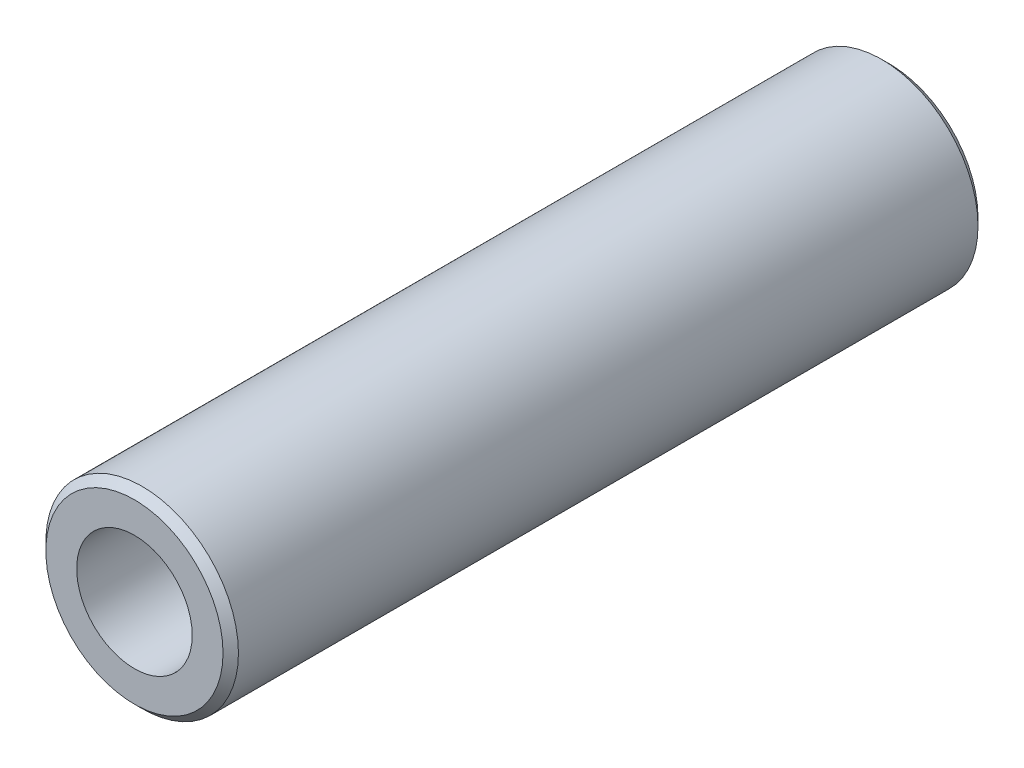
ISO-10303-21;
HEADER;
FILE_DESCRIPTION(('STEP AP214'),'2;1');
FILE_NAME('part.step','',(''),(''),'','','');
FILE_SCHEMA(('AUTOMOTIVE_DESIGN { 1 0 10303 214 1 1 1 1 }'));
ENDSEC;
DATA;
#1=APPLICATION_CONTEXT('core data for automotive mechanical design processes');
#2=APPLICATION_PROTOCOL_DEFINITION('international standard','automotive_design',2000,#1);
#3=PRODUCT_CONTEXT('',#1,'mechanical');
#4=PRODUCT('Part','Part','',(#3));
#5=PRODUCT_RELATED_PRODUCT_CATEGORY('part','',(#4));
#6=PRODUCT_DEFINITION_FORMATION('','',#4);
#7=PRODUCT_DEFINITION_CONTEXT('part definition',#1,'design');
#8=PRODUCT_DEFINITION('design','',#6,#7);
#9=PRODUCT_DEFINITION_SHAPE('','',#8);
#10=(LENGTH_UNIT() NAMED_UNIT(*) SI_UNIT(.MILLI.,.METRE.));
#11=(NAMED_UNIT(*) PLANE_ANGLE_UNIT() SI_UNIT($,.RADIAN.));
#12=(NAMED_UNIT(*) SI_UNIT($,.STERADIAN.) SOLID_ANGLE_UNIT());
#13=UNCERTAINTY_MEASURE_WITH_UNIT(LENGTH_MEASURE(1.E-05),#10,'distance_accuracy_value','');
#14=(GEOMETRIC_REPRESENTATION_CONTEXT(3) GLOBAL_UNCERTAINTY_ASSIGNED_CONTEXT((#13)) GLOBAL_UNIT_ASSIGNED_CONTEXT((#10,
#11,#12)) REPRESENTATION_CONTEXT('',''));
#15=CARTESIAN_POINT('',(0.,0.,0.));
#16=DIRECTION('',(0.,0.,1.));
#17=DIRECTION('',(1.,0.,0.));
#18=AXIS2_PLACEMENT_3D('',#15,#16,#17);
#19=CARTESIAN_POINT('',(0.,0.,24.5));
#20=DIRECTION('',(0.,0.,1.));
#21=DIRECTION('',(1.,0.,0.));
#22=AXIS2_PLACEMENT_3D('',#19,#20,#21);
#23=PLANE('',#22);
#24=CARTESIAN_POINT('',(0.,0.,24.5));
#25=DIRECTION('',(0.,0.,1.));
#26=DIRECTION('',(1.,0.,0.));
#27=AXIS2_PLACEMENT_3D('',#24,#25,#26);
#28=CIRCLE('',#27,5.75);
#29=CARTESIAN_POINT('',(5.75,0.,24.5));
#30=VERTEX_POINT('',#29);
#31=EDGE_CURVE('E11',#30,#30,#28,.T.);
#32=ORIENTED_EDGE('',*,*,#31,.T.);
#33=EDGE_LOOP('',(#32));
#34=FACE_BOUND('',#33,.T.);
#35=CARTESIAN_POINT('',(0.,0.,24.5));
#36=DIRECTION('',(0.,0.,1.));
#37=DIRECTION('',(1.,0.,0.));
#38=AXIS2_PLACEMENT_3D('',#35,#36,#37);
#39=CIRCLE('',#38,3.75);
#40=CARTESIAN_POINT('',(3.75,0.,24.5));
#41=VERTEX_POINT('',#40);
#42=EDGE_CURVE('E70',#41,#41,#39,.T.);
#43=ORIENTED_EDGE('',*,*,#42,.F.);
#44=EDGE_LOOP('',(#43));
#45=FACE_BOUND('',#44,.T.);
#46=ADVANCED_FACE('F49',(#34,#45),#23,.T.);
#47=CARTESIAN_POINT('',(0.,0.,-24.5));
#48=DIRECTION('',(0.,0.,1.));
#49=DIRECTION('',(1.,0.,0.));
#50=AXIS2_PLACEMENT_3D('',#47,#48,#49);
#51=PLANE('',#50);
#52=CARTESIAN_POINT('',(0.,0.,-24.5));
#53=DIRECTION('',(0.,0.,1.));
#54=DIRECTION('',(1.,0.,0.));
#55=AXIS2_PLACEMENT_3D('',#52,#53,#54);
#56=CIRCLE('',#55,5.74999999999998);
#57=CARTESIAN_POINT('',(5.74999999999998,0.,-24.5));
#58=VERTEX_POINT('',#57);
#59=EDGE_CURVE('E57',#58,#58,#56,.F.);
#60=ORIENTED_EDGE('',*,*,#59,.T.);
#61=EDGE_LOOP('',(#60));
#62=FACE_BOUND('',#61,.T.);
#63=CARTESIAN_POINT('',(0.,0.,-24.5));
#64=DIRECTION('',(0.,0.,1.));
#65=DIRECTION('',(1.,0.,0.));
#66=AXIS2_PLACEMENT_3D('',#63,#64,#65);
#67=CIRCLE('',#66,3.75);
#68=CARTESIAN_POINT('',(3.75,0.,-24.5));
#69=VERTEX_POINT('',#68);
#70=EDGE_CURVE('E71',#69,#69,#67,.T.);
#71=ORIENTED_EDGE('',*,*,#70,.T.);
#72=EDGE_LOOP('',(#71));
#73=FACE_BOUND('',#72,.T.);
#74=ADVANCED_FACE('F81',(#62,#73),#51,.F.);
#75=CARTESIAN_POINT('',(0.,0.,24.5));
#76=DIRECTION('',(0.,0.,-1.));
#77=DIRECTION('',(-1.,0.,0.));
#78=AXIS2_PLACEMENT_3D('',#75,#76,#77);
#79=CYLINDRICAL_SURFACE('',#78,6.25);
#80=CARTESIAN_POINT('',(0.,0.,-24.));
#81=DIRECTION('',(0.,0.,1.));
#82=DIRECTION('',(1.,0.,0.));
#83=AXIS2_PLACEMENT_3D('',#80,#81,#82);
#84=CIRCLE('',#83,6.25);
#85=CARTESIAN_POINT('',(6.25,0.,-24.));
#86=VERTEX_POINT('',#85);
#87=EDGE_CURVE('E61',#86,#86,#84,.T.);
#88=ORIENTED_EDGE('',*,*,#87,.T.);
#89=EDGE_LOOP('',(#88));
#90=FACE_BOUND('',#89,.T.);
#91=CARTESIAN_POINT('',(0.,0.,24.));
#92=DIRECTION('',(0.,0.,1.));
#93=DIRECTION('',(1.,0.,0.));
#94=AXIS2_PLACEMENT_3D('',#91,#92,#93);
#95=CIRCLE('',#94,6.25);
#96=CARTESIAN_POINT('',(6.25,0.,24.));
#97=VERTEX_POINT('',#96);
#98=EDGE_CURVE('E65',#97,#97,#95,.F.);
#99=ORIENTED_EDGE('',*,*,#98,.T.);
#100=EDGE_LOOP('',(#99));
#101=FACE_BOUND('',#100,.T.);
#102=ADVANCED_FACE('F86',(#90,#101),#79,.T.);
#103=CARTESIAN_POINT('',(0.,0.,24.5));
#104=DIRECTION('',(0.,0.,-1.));
#105=DIRECTION('',(-1.,0.,0.));
#106=AXIS2_PLACEMENT_3D('',#103,#104,#105);
#107=CYLINDRICAL_SURFACE('',#106,3.75);
#108=ORIENTED_EDGE('',*,*,#42,.T.);
#109=EDGE_LOOP('',(#108));
#110=FACE_BOUND('',#109,.T.);
#111=ORIENTED_EDGE('',*,*,#70,.F.);
#112=EDGE_LOOP('',(#111));
#113=FACE_BOUND('',#112,.T.);
#114=ADVANCED_FACE('F77',(#110,#113),#107,.F.);
#115=CARTESIAN_POINT('',(0.,0.,-24.));
#116=DIRECTION('',(0.,0.,1.));
#117=DIRECTION('',(1.,0.,0.));
#118=AXIS2_PLACEMENT_3D('',#115,#116,#117);
#119=CONICAL_SURFACE('',#118,6.25,0.785398163397454);
#120=ORIENTED_EDGE('',*,*,#59,.F.);
#121=EDGE_LOOP('',(#120));
#122=FACE_BOUND('',#121,.T.);
#123=ORIENTED_EDGE('',*,*,#87,.F.);
#124=EDGE_LOOP('',(#123));
#125=FACE_BOUND('',#124,.T.);
#126=ADVANCED_FACE('F93',(#122,#125),#119,.T.);
#127=CARTESIAN_POINT('',(0.,0.,24.5));
#128=DIRECTION('',(0.,0.,-1.));
#129=DIRECTION('',(-1.,0.,0.));
#130=AXIS2_PLACEMENT_3D('',#127,#128,#129);
#131=CONICAL_SURFACE('',#130,5.75,0.785398163397447);
#132=ORIENTED_EDGE('',*,*,#98,.F.);
#133=EDGE_LOOP('',(#132));
#134=FACE_BOUND('',#133,.T.);
#135=ORIENTED_EDGE('',*,*,#31,.F.);
#136=EDGE_LOOP('',(#135));
#137=FACE_BOUND('',#136,.T.);
#138=ADVANCED_FACE('F52',(#134,#137),#131,.T.);
#139=CLOSED_SHELL('',(#46,#74,#102,#114,#126,#138));
#140=MANIFOLD_SOLID_BREP('B2',#139);
#141=ADVANCED_BREP_SHAPE_REPRESENTATION('',(#18,#140),#14);
#142=SHAPE_DEFINITION_REPRESENTATION(#9,#141);
ENDSEC;
END-ISO-10303-21;
